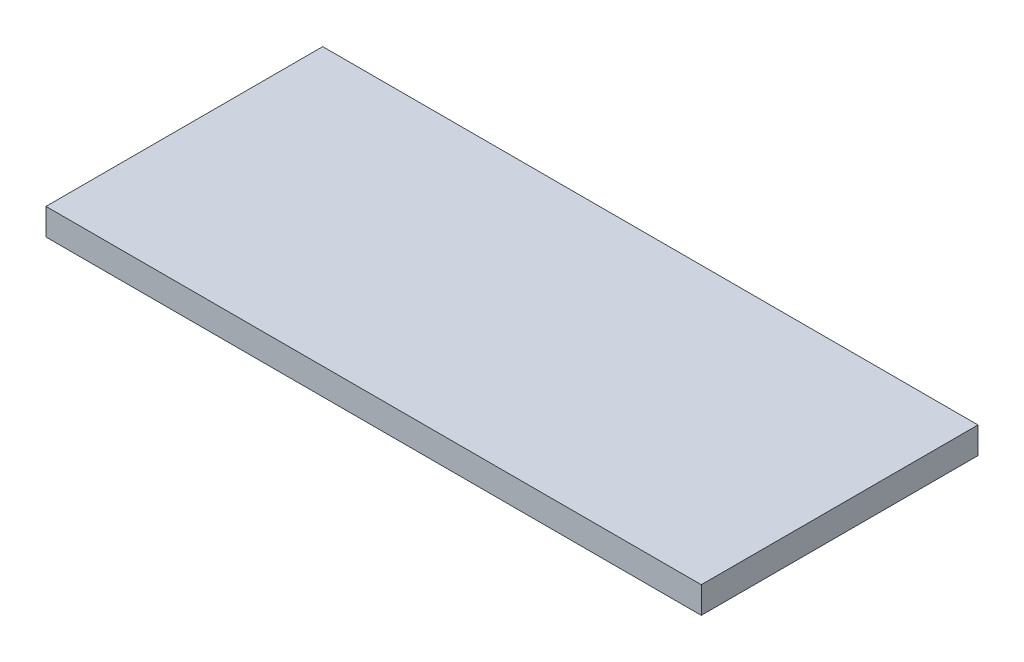
ISO-10303-21;
HEADER;
FILE_DESCRIPTION(('STEP AP214'),'2;1');
FILE_NAME('part.step','',(''),(''),'','','');
FILE_SCHEMA(('AUTOMOTIVE_DESIGN { 1 0 10303 214 1 1 1 1 }'));
ENDSEC;
DATA;
#1=APPLICATION_CONTEXT('core data for automotive mechanical design processes');
#2=APPLICATION_PROTOCOL_DEFINITION('international standard','automotive_design',2000,#1);
#3=PRODUCT_CONTEXT('',#1,'mechanical');
#4=PRODUCT('Part','Part','',(#3));
#5=PRODUCT_RELATED_PRODUCT_CATEGORY('part','',(#4));
#6=PRODUCT_DEFINITION_FORMATION('','',#4);
#7=PRODUCT_DEFINITION_CONTEXT('part definition',#1,'design');
#8=PRODUCT_DEFINITION('design','',#6,#7);
#9=PRODUCT_DEFINITION_SHAPE('','',#8);
#10=(LENGTH_UNIT() NAMED_UNIT(*) SI_UNIT(.MILLI.,.METRE.));
#11=(NAMED_UNIT(*) PLANE_ANGLE_UNIT() SI_UNIT($,.RADIAN.));
#12=(NAMED_UNIT(*) SI_UNIT($,.STERADIAN.) SOLID_ANGLE_UNIT());
#13=UNCERTAINTY_MEASURE_WITH_UNIT(LENGTH_MEASURE(1.E-05),#10,'distance_accuracy_value','');
#14=(GEOMETRIC_REPRESENTATION_CONTEXT(3) GLOBAL_UNCERTAINTY_ASSIGNED_CONTEXT((#13)) GLOBAL_UNIT_ASSIGNED_CONTEXT((#10,
#11,#12)) REPRESENTATION_CONTEXT('',''));
#15=CARTESIAN_POINT('',(0.,0.,0.));
#16=DIRECTION('',(0.,0.,1.));
#17=DIRECTION('',(1.,0.,0.));
#18=AXIS2_PLACEMENT_3D('',#15,#16,#17);
#19=CARTESIAN_POINT('',(74.,6.,-62.5));
#20=DIRECTION('',(-1.,0.,0.));
#21=DIRECTION('',(0.,0.,1.));
#22=AXIS2_PLACEMENT_3D('',#19,#20,#21);
#23=PLANE('',#22);
#24=DIRECTION('',(0.,0.,-1.));
#25=VECTOR('',#24,1.);
#26=CARTESIAN_POINT('',(74.,0.,-62.5));
#27=LINE('',#26,#25);
#28=CARTESIAN_POINT('',(74.,0.,0.));
#29=VERTEX_POINT('',#28);
#30=CARTESIAN_POINT('',(74.,0.,-62.5));
#31=VERTEX_POINT('',#30);
#32=EDGE_CURVE('E95',#29,#31,#27,.T.);
#33=ORIENTED_EDGE('',*,*,#32,.T.);
#34=DIRECTION('',(0.,-1.,0.));
#35=VECTOR('',#34,1.);
#36=CARTESIAN_POINT('',(74.,6.,-62.5));
#37=LINE('',#36,#35);
#38=CARTESIAN_POINT('',(74.,6.,-62.5));
#39=VERTEX_POINT('',#38);
#40=EDGE_CURVE('E11',#39,#31,#37,.T.);
#41=ORIENTED_EDGE('',*,*,#40,.F.);
#42=DIRECTION('',(0.,0.,-1.));
#43=VECTOR('',#42,1.);
#44=CARTESIAN_POINT('',(74.,6.,-62.5));
#45=LINE('',#44,#43);
#46=CARTESIAN_POINT('',(74.,6.,0.));
#47=VERTEX_POINT('',#46);
#48=EDGE_CURVE('E83',#47,#39,#45,.T.);
#49=ORIENTED_EDGE('',*,*,#48,.F.);
#50=DIRECTION('',(0.,-1.,0.));
#51=VECTOR('',#50,1.);
#52=CARTESIAN_POINT('',(74.,6.,0.));
#53=LINE('',#52,#51);
#54=EDGE_CURVE('E91',#47,#29,#53,.T.);
#55=ORIENTED_EDGE('',*,*,#54,.T.);
#56=EDGE_LOOP('',(#33,#41,#49,#55));
#57=FACE_BOUND('',#56,.T.);
#58=ADVANCED_FACE('F32',(#57),#23,.F.);
#59=CARTESIAN_POINT('',(-74.,6.,-62.5));
#60=DIRECTION('',(0.,0.,1.));
#61=DIRECTION('',(1.,0.,0.));
#62=AXIS2_PLACEMENT_3D('',#59,#60,#61);
#63=PLANE('',#62);
#64=DIRECTION('',(-1.,0.,0.));
#65=VECTOR('',#64,1.);
#66=CARTESIAN_POINT('',(-74.,0.,-62.5));
#67=LINE('',#66,#65);
#68=CARTESIAN_POINT('',(-74.,0.,-62.5));
#69=VERTEX_POINT('',#68);
#70=EDGE_CURVE('E87',#31,#69,#67,.T.);
#71=ORIENTED_EDGE('',*,*,#70,.T.);
#72=DIRECTION('',(0.,-1.,0.));
#73=VECTOR('',#72,1.);
#74=CARTESIAN_POINT('',(-74.,6.,-62.5));
#75=LINE('',#74,#73);
#76=CARTESIAN_POINT('',(-74.,6.,-62.5));
#77=VERTEX_POINT('',#76);
#78=EDGE_CURVE('E40',#77,#69,#75,.T.);
#79=ORIENTED_EDGE('',*,*,#78,.F.);
#80=DIRECTION('',(-1.,0.,0.));
#81=VECTOR('',#80,1.);
#82=CARTESIAN_POINT('',(-74.,6.,-62.5));
#83=LINE('',#82,#81);
#84=EDGE_CURVE('E78',#39,#77,#83,.T.);
#85=ORIENTED_EDGE('',*,*,#84,.F.);
#86=ORIENTED_EDGE('',*,*,#40,.T.);
#87=EDGE_LOOP('',(#71,#79,#85,#86));
#88=FACE_BOUND('',#87,.T.);
#89=ADVANCED_FACE('F86',(#88),#63,.F.);
#90=CARTESIAN_POINT('',(-74.,6.,-62.5));
#91=DIRECTION('',(1.,0.,0.));
#92=DIRECTION('',(0.,0.,-1.));
#93=AXIS2_PLACEMENT_3D('',#90,#91,#92);
#94=PLANE('',#93);
#95=DIRECTION('',(0.,0.,1.));
#96=VECTOR('',#95,1.);
#97=CARTESIAN_POINT('',(-74.,0.,-62.5));
#98=LINE('',#97,#96);
#99=CARTESIAN_POINT('',(-74.,0.,0.));
#100=VERTEX_POINT('',#99);
#101=EDGE_CURVE('E65',#69,#100,#98,.T.);
#102=ORIENTED_EDGE('',*,*,#101,.T.);
#103=DIRECTION('',(0.,-1.,0.));
#104=VECTOR('',#103,1.);
#105=CARTESIAN_POINT('',(-74.,6.,0.));
#106=LINE('',#105,#104);
#107=CARTESIAN_POINT('',(-74.,6.,0.));
#108=VERTEX_POINT('',#107);
#109=EDGE_CURVE('E88',#108,#100,#106,.T.);
#110=ORIENTED_EDGE('',*,*,#109,.F.);
#111=DIRECTION('',(0.,0.,1.));
#112=VECTOR('',#111,1.);
#113=CARTESIAN_POINT('',(-74.,6.,-62.5));
#114=LINE('',#113,#112);
#115=EDGE_CURVE('E81',#77,#108,#114,.T.);
#116=ORIENTED_EDGE('',*,*,#115,.F.);
#117=ORIENTED_EDGE('',*,*,#78,.T.);
#118=EDGE_LOOP('',(#102,#110,#116,#117));
#119=FACE_BOUND('',#118,.T.);
#120=ADVANCED_FACE('F89',(#119),#94,.F.);
#121=CARTESIAN_POINT('',(-74.,6.,0.));
#122=DIRECTION('',(0.,0.,-1.));
#123=DIRECTION('',(-1.,0.,0.));
#124=AXIS2_PLACEMENT_3D('',#121,#122,#123);
#125=PLANE('',#124);
#126=DIRECTION('',(1.,0.,0.));
#127=VECTOR('',#126,1.);
#128=CARTESIAN_POINT('',(-74.,0.,0.));
#129=LINE('',#128,#127);
#130=EDGE_CURVE('E71',#100,#29,#129,.T.);
#131=ORIENTED_EDGE('',*,*,#130,.T.);
#132=ORIENTED_EDGE('',*,*,#54,.F.);
#133=DIRECTION('',(1.,0.,0.));
#134=VECTOR('',#133,1.);
#135=CARTESIAN_POINT('',(-74.,6.,0.));
#136=LINE('',#135,#134);
#137=EDGE_CURVE('E48',#108,#47,#136,.T.);
#138=ORIENTED_EDGE('',*,*,#137,.F.);
#139=ORIENTED_EDGE('',*,*,#109,.T.);
#140=EDGE_LOOP('',(#131,#132,#138,#139));
#141=FACE_BOUND('',#140,.T.);
#142=ADVANCED_FACE('F102',(#141),#125,.F.);
#143=CARTESIAN_POINT('',(0.,6.,0.));
#144=DIRECTION('',(0.,1.,0.));
#145=DIRECTION('',(0.,0.,1.));
#146=AXIS2_PLACEMENT_3D('',#143,#144,#145);
#147=PLANE('',#146);
#148=ORIENTED_EDGE('',*,*,#48,.T.);
#149=ORIENTED_EDGE('',*,*,#84,.T.);
#150=ORIENTED_EDGE('',*,*,#115,.T.);
#151=ORIENTED_EDGE('',*,*,#137,.T.);
#152=EDGE_LOOP('',(#148,#149,#150,#151));
#153=FACE_BOUND('',#152,.T.);
#154=ADVANCED_FACE('F79',(#153),#147,.T.);
#155=CARTESIAN_POINT('',(0.,0.,0.));
#156=DIRECTION('',(0.,1.,0.));
#157=DIRECTION('',(0.,0.,1.));
#158=AXIS2_PLACEMENT_3D('',#155,#156,#157);
#159=PLANE('',#158);
#160=ORIENTED_EDGE('',*,*,#32,.F.);
#161=ORIENTED_EDGE('',*,*,#130,.F.);
#162=ORIENTED_EDGE('',*,*,#101,.F.);
#163=ORIENTED_EDGE('',*,*,#70,.F.);
#164=EDGE_LOOP('',(#160,#161,#162,#163));
#165=FACE_BOUND('',#164,.T.);
#166=ADVANCED_FACE('F105',(#165),#159,.F.);
#167=CLOSED_SHELL('',(#58,#89,#120,#142,#154,#166));
#168=MANIFOLD_SOLID_BREP('B2',#167);
#169=ADVANCED_BREP_SHAPE_REPRESENTATION('',(#18,#168),#14);
#170=SHAPE_DEFINITION_REPRESENTATION(#9,#169);
ENDSEC;
END-ISO-10303-21;
